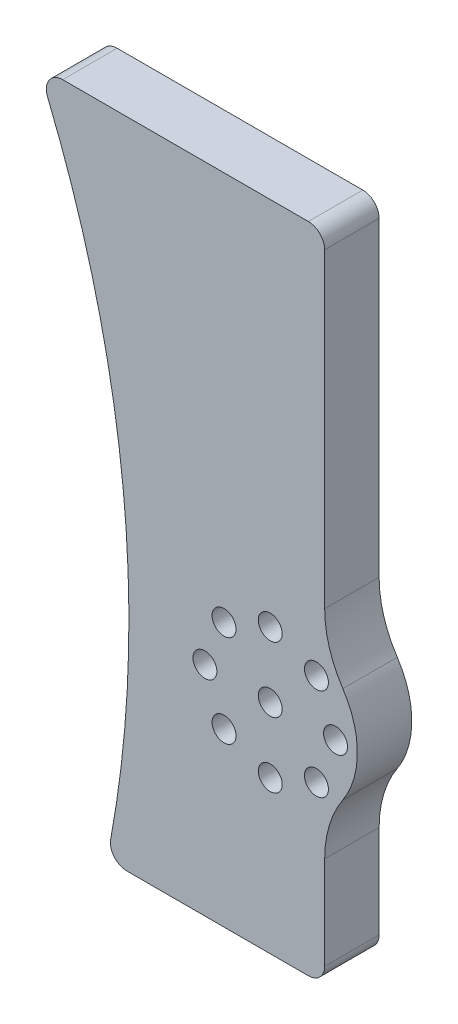
ISO-10303-21;
HEADER;
FILE_DESCRIPTION(('STEP AP214'),'2;1');
FILE_NAME('part.step','',(''),(''),'','','');
FILE_SCHEMA(('AUTOMOTIVE_DESIGN { 1 0 10303 214 1 1 1 1 }'));
ENDSEC;
DATA;
#1=APPLICATION_CONTEXT('core data for automotive mechanical design processes');
#2=APPLICATION_PROTOCOL_DEFINITION('international standard','automotive_design',2000,#1);
#3=PRODUCT_CONTEXT('',#1,'mechanical');
#4=PRODUCT('Part','Part','',(#3));
#5=PRODUCT_RELATED_PRODUCT_CATEGORY('part','',(#4));
#6=PRODUCT_DEFINITION_FORMATION('','',#4);
#7=PRODUCT_DEFINITION_CONTEXT('part definition',#1,'design');
#8=PRODUCT_DEFINITION('design','',#6,#7);
#9=PRODUCT_DEFINITION_SHAPE('','',#8);
#10=(LENGTH_UNIT() NAMED_UNIT(*) SI_UNIT(.MILLI.,.METRE.));
#11=(NAMED_UNIT(*) PLANE_ANGLE_UNIT() SI_UNIT($,.RADIAN.));
#12=(NAMED_UNIT(*) SI_UNIT($,.STERADIAN.) SOLID_ANGLE_UNIT());
#13=UNCERTAINTY_MEASURE_WITH_UNIT(LENGTH_MEASURE(1.E-05),#10,'distance_accuracy_value','');
#14=(GEOMETRIC_REPRESENTATION_CONTEXT(3) GLOBAL_UNCERTAINTY_ASSIGNED_CONTEXT((#13)) GLOBAL_UNIT_ASSIGNED_CONTEXT((#10,
#11,#12)) REPRESENTATION_CONTEXT('',''));
#15=CARTESIAN_POINT('',(0.,0.,0.));
#16=DIRECTION('',(0.,0.,1.));
#17=DIRECTION('',(1.,0.,0.));
#18=AXIS2_PLACEMENT_3D('',#15,#16,#17);
#19=CARTESIAN_POINT('',(-15.,10.0501256289338,5.));
#20=DIRECTION('',(0.,0.,-1.));
#21=DIRECTION('',(-1.,0.,0.));
#22=AXIS2_PLACEMENT_3D('',#19,#20,#21);
#23=PLANE('',#22);
#24=DIRECTION('',(1.,0.,0.));
#25=VECTOR('',#24,1.);
#26=CARTESIAN_POINT('',(-5.00000000000001,0.,5.));
#27=LINE('',#26,#25);
#28=CARTESIAN_POINT('',(-13.1797901123299,0.,5.));
#29=VERTEX_POINT('',#28);
#30=CARTESIAN_POINT('',(3.50000000000001,0.,5.));
#31=VERTEX_POINT('',#30);
#32=EDGE_CURVE('E192',#29,#31,#27,.T.);
#33=ORIENTED_EDGE('',*,*,#32,.T.);
#34=CARTESIAN_POINT('',(3.50000000000001,1.5,5.));
#35=DIRECTION('',(0.,0.,-1.));
#36=DIRECTION('',(-1.,0.,0.));
#37=AXIS2_PLACEMENT_3D('',#34,#35,#36);
#38=CIRCLE('',#37,1.5);
#39=CARTESIAN_POINT('',(5.00000000000001,1.5,5.));
#40=VERTEX_POINT('',#39);
#41=EDGE_CURVE('E128',#31,#40,#38,.F.);
#42=ORIENTED_EDGE('',*,*,#41,.T.);
#43=DIRECTION('',(0.,1.,0.));
#44=VECTOR('',#43,1.);
#45=CARTESIAN_POINT('',(5.00000000000001,10.0501256289338,5.));
#46=LINE('',#45,#44);
#47=CARTESIAN_POINT('',(5.00000000000001,10.0501256289338,5.));
#48=VERTEX_POINT('',#47);
#49=EDGE_CURVE('E121',#40,#48,#46,.T.);
#50=ORIENTED_EDGE('',*,*,#49,.T.);
#51=CARTESIAN_POINT('',(15.,10.0501256289338,5.));
#52=DIRECTION('',(0.,0.,-1.));
#53=DIRECTION('',(-1.,0.,0.));
#54=AXIS2_PLACEMENT_3D('',#51,#52,#53);
#55=CIRCLE('',#54,10.);
#56=CARTESIAN_POINT('',(6.66666666666667,15.5778336128595,5.));
#57=VERTEX_POINT('',#56);
#58=EDGE_CURVE('E125',#48,#57,#55,.T.);
#59=ORIENTED_EDGE('',*,*,#58,.T.);
#60=CARTESIAN_POINT('',(0.,20.,5.));
#61=DIRECTION('',(0.,0.,1.));
#62=DIRECTION('',(1.,0.,0.));
#63=AXIS2_PLACEMENT_3D('',#60,#61,#62);
#64=CIRCLE('',#63,8.);
#65=CARTESIAN_POINT('',(6.66666666666667,24.4221663871405,5.));
#66=VERTEX_POINT('',#65);
#67=EDGE_CURVE('E142',#57,#66,#64,.T.);
#68=ORIENTED_EDGE('',*,*,#67,.T.);
#69=CARTESIAN_POINT('',(15.,29.9498743710662,5.));
#70=DIRECTION('',(0.,0.,-1.));
#71=DIRECTION('',(1.,0.,0.));
#72=AXIS2_PLACEMENT_3D('',#69,#70,#71);
#73=CIRCLE('',#72,10.);
#74=CARTESIAN_POINT('',(5.,29.9498743710662,5.));
#75=VERTEX_POINT('',#74);
#76=EDGE_CURVE('E263',#66,#75,#73,.T.);
#77=ORIENTED_EDGE('',*,*,#76,.T.);
#78=DIRECTION('',(0.,1.,0.));
#79=VECTOR('',#78,1.);
#80=CARTESIAN_POINT('',(4.99999999999999,60.,5.));
#81=LINE('',#80,#79);
#82=CARTESIAN_POINT('',(4.99999999999999,58.5,5.));
#83=VERTEX_POINT('',#82);
#84=EDGE_CURVE('E193',#75,#83,#81,.T.);
#85=ORIENTED_EDGE('',*,*,#84,.T.);
#86=CARTESIAN_POINT('',(3.49999999999999,58.5,5.));
#87=DIRECTION('',(0.,0.,-1.));
#88=DIRECTION('',(-1.,0.,0.));
#89=AXIS2_PLACEMENT_3D('',#86,#87,#88);
#90=CIRCLE('',#89,1.5);
#91=CARTESIAN_POINT('',(3.49999999999999,60.,5.));
#92=VERTEX_POINT('',#91);
#93=EDGE_CURVE('E168',#83,#92,#90,.F.);
#94=ORIENTED_EDGE('',*,*,#93,.T.);
#95=DIRECTION('',(-1.,0.,0.));
#96=VECTOR('',#95,1.);
#97=CARTESIAN_POINT('',(-5.00000000000001,60.,5.));
#98=LINE('',#97,#96);
#99=CARTESIAN_POINT('',(-19.064734656336,60.,5.));
#100=VERTEX_POINT('',#99);
#101=EDGE_CURVE('E185',#92,#100,#98,.T.);
#102=ORIENTED_EDGE('',*,*,#101,.T.);
#103=CARTESIAN_POINT('',(-19.064734656336,58.5,5.));
#104=DIRECTION('',(0.,0.,-1.));
#105=DIRECTION('',(-1.,0.,0.));
#106=AXIS2_PLACEMENT_3D('',#103,#104,#105);
#107=CIRCLE('',#106,1.5);
#108=CARTESIAN_POINT('',(-20.4526389182324,57.9310344827586,5.));
#109=VERTEX_POINT('',#108);
#110=EDGE_CURVE('E48',#100,#109,#107,.F.);
#111=ORIENTED_EDGE('',*,*,#110,.T.);
#112=CARTESIAN_POINT('',(-112.979589711327,20.,5.));
#113=DIRECTION('',(0.,0.,1.));
#114=DIRECTION('',(-1.,0.,0.));
#115=AXIS2_PLACEMENT_3D('',#112,#113,#114);
#116=CIRCLE('',#115,100.);
#117=CARTESIAN_POINT('',(-14.6546639980294,1.77339901477833,5.));
#118=VERTEX_POINT('',#117);
#119=EDGE_CURVE('E200',#118,#109,#116,.T.);
#120=ORIENTED_EDGE('',*,*,#119,.F.);
#121=CARTESIAN_POINT('',(-13.1797901123299,1.5,5.));
#122=DIRECTION('',(0.,0.,-1.));
#123=DIRECTION('',(-1.,0.,0.));
#124=AXIS2_PLACEMENT_3D('',#121,#122,#123);
#125=CIRCLE('',#124,1.5);
#126=EDGE_CURVE('E171',#118,#29,#125,.F.);
#127=ORIENTED_EDGE('',*,*,#126,.T.);
#128=EDGE_LOOP('',(#33,#42,#50,#59,#68,#77,#85,#94,#102,#111,#120,#127));
#129=FACE_BOUND('',#128,.T.);
#130=CARTESIAN_POINT('',(0.,20.,5.));
#131=DIRECTION('',(0.,0.,1.));
#132=DIRECTION('',(1.,0.,0.));
#133=AXIS2_PLACEMENT_3D('',#130,#131,#132);
#134=CIRCLE('',#133,1.1);
#135=CARTESIAN_POINT('',(1.1,20.,5.));
#136=VERTEX_POINT('',#135);
#137=EDGE_CURVE('E257',#136,#136,#134,.T.);
#138=ORIENTED_EDGE('',*,*,#137,.F.);
#139=EDGE_LOOP('',(#138));
#140=FACE_BOUND('',#139,.T.);
#141=CARTESIAN_POINT('',(0.,14.,5.));
#142=DIRECTION('',(0.,0.,1.));
#143=DIRECTION('',(1.,0.,0.));
#144=AXIS2_PLACEMENT_3D('',#141,#142,#143);
#145=CIRCLE('',#144,1.1);
#146=CARTESIAN_POINT('',(1.1,14.,5.));
#147=VERTEX_POINT('',#146);
#148=EDGE_CURVE('E251',#147,#147,#145,.T.);
#149=ORIENTED_EDGE('',*,*,#148,.F.);
#150=EDGE_LOOP('',(#149));
#151=FACE_BOUND('',#150,.T.);
#152=CARTESIAN_POINT('',(-4.24264068711928,15.7573593128807,5.));
#153=DIRECTION('',(0.,0.,1.));
#154=DIRECTION('',(1.,0.,0.));
#155=AXIS2_PLACEMENT_3D('',#152,#153,#154);
#156=CIRCLE('',#155,1.1);
#157=CARTESIAN_POINT('',(-3.14264068711928,15.7573593128807,5.));
#158=VERTEX_POINT('',#157);
#159=EDGE_CURVE('E245',#158,#158,#156,.T.);
#160=ORIENTED_EDGE('',*,*,#159,.F.);
#161=EDGE_LOOP('',(#160));
#162=FACE_BOUND('',#161,.T.);
#163=CARTESIAN_POINT('',(-5.99999999999999,20.,5.));
#164=DIRECTION('',(0.,0.,1.));
#165=DIRECTION('',(1.,0.,0.));
#166=AXIS2_PLACEMENT_3D('',#163,#164,#165);
#167=CIRCLE('',#166,1.1);
#168=CARTESIAN_POINT('',(-4.89999999999999,20.,5.));
#169=VERTEX_POINT('',#168);
#170=EDGE_CURVE('E239',#169,#169,#167,.T.);
#171=ORIENTED_EDGE('',*,*,#170,.F.);
#172=EDGE_LOOP('',(#171));
#173=FACE_BOUND('',#172,.T.);
#174=CARTESIAN_POINT('',(-4.24264068711928,24.2426406871193,5.));
#175=DIRECTION('',(0.,0.,1.));
#176=DIRECTION('',(1.,0.,0.));
#177=AXIS2_PLACEMENT_3D('',#174,#175,#176);
#178=CIRCLE('',#177,1.1);
#179=CARTESIAN_POINT('',(-3.14264068711928,24.2426406871193,5.));
#180=VERTEX_POINT('',#179);
#181=EDGE_CURVE('E233',#180,#180,#178,.T.);
#182=ORIENTED_EDGE('',*,*,#181,.F.);
#183=EDGE_LOOP('',(#182));
#184=FACE_BOUND('',#183,.T.);
#185=CARTESIAN_POINT('',(0.,26.,5.));
#186=DIRECTION('',(0.,0.,1.));
#187=DIRECTION('',(1.,0.,0.));
#188=AXIS2_PLACEMENT_3D('',#185,#186,#187);
#189=CIRCLE('',#188,1.1);
#190=CARTESIAN_POINT('',(1.1,26.,5.));
#191=VERTEX_POINT('',#190);
#192=EDGE_CURVE('E227',#191,#191,#189,.T.);
#193=ORIENTED_EDGE('',*,*,#192,.F.);
#194=EDGE_LOOP('',(#193));
#195=FACE_BOUND('',#194,.T.);
#196=CARTESIAN_POINT('',(4.24264068711928,24.2426406871193,5.));
#197=DIRECTION('',(0.,0.,1.));
#198=DIRECTION('',(1.,0.,0.));
#199=AXIS2_PLACEMENT_3D('',#196,#197,#198);
#200=CIRCLE('',#199,1.1);
#201=CARTESIAN_POINT('',(5.34264068711928,24.2426406871193,5.));
#202=VERTEX_POINT('',#201);
#203=EDGE_CURVE('E221',#202,#202,#200,.T.);
#204=ORIENTED_EDGE('',*,*,#203,.F.);
#205=EDGE_LOOP('',(#204));
#206=FACE_BOUND('',#205,.T.);
#207=CARTESIAN_POINT('',(5.99999999999999,20.,5.));
#208=DIRECTION('',(0.,0.,1.));
#209=DIRECTION('',(1.,0.,0.));
#210=AXIS2_PLACEMENT_3D('',#207,#208,#209);
#211=CIRCLE('',#210,1.1);
#212=CARTESIAN_POINT('',(7.09999999999999,20.,5.));
#213=VERTEX_POINT('',#212);
#214=EDGE_CURVE('E215',#213,#213,#211,.T.);
#215=ORIENTED_EDGE('',*,*,#214,.F.);
#216=EDGE_LOOP('',(#215));
#217=FACE_BOUND('',#216,.T.);
#218=CARTESIAN_POINT('',(4.24264068711927,15.7573593128807,5.));
#219=DIRECTION('',(0.,0.,1.));
#220=DIRECTION('',(1.,0.,0.));
#221=AXIS2_PLACEMENT_3D('',#218,#219,#220);
#222=CIRCLE('',#221,1.1);
#223=CARTESIAN_POINT('',(5.34264068711927,15.7573593128807,5.));
#224=VERTEX_POINT('',#223);
#225=EDGE_CURVE('E209',#224,#224,#222,.T.);
#226=ORIENTED_EDGE('',*,*,#225,.F.);
#227=EDGE_LOOP('',(#226));
#228=FACE_BOUND('',#227,.T.);
#229=ADVANCED_FACE('F33',(#129,#140,#151,#162,#173,#184,#195,#206,#217,#228),#23,.F.);
#230=CARTESIAN_POINT('',(-15.,10.0501256289338,0.));
#231=DIRECTION('',(0.,0.,-1.));
#232=DIRECTION('',(-1.,0.,0.));
#233=AXIS2_PLACEMENT_3D('',#230,#231,#232);
#234=PLANE('',#233);
#235=CARTESIAN_POINT('',(5.99999999999999,20.,0.));
#236=DIRECTION('',(0.,0.,1.));
#237=DIRECTION('',(1.,0.,0.));
#238=AXIS2_PLACEMENT_3D('',#235,#236,#237);
#239=CIRCLE('',#238,1.1);
#240=CARTESIAN_POINT('',(7.09999999999999,20.,0.));
#241=VERTEX_POINT('',#240);
#242=EDGE_CURVE('E212',#241,#241,#239,.T.);
#243=ORIENTED_EDGE('',*,*,#242,.T.);
#244=EDGE_LOOP('',(#243));
#245=FACE_BOUND('',#244,.T.);
#246=CARTESIAN_POINT('',(0.,26.,0.));
#247=DIRECTION('',(0.,0.,1.));
#248=DIRECTION('',(1.,0.,0.));
#249=AXIS2_PLACEMENT_3D('',#246,#247,#248);
#250=CIRCLE('',#249,1.1);
#251=CARTESIAN_POINT('',(1.1,26.,0.));
#252=VERTEX_POINT('',#251);
#253=EDGE_CURVE('E224',#252,#252,#250,.T.);
#254=ORIENTED_EDGE('',*,*,#253,.T.);
#255=EDGE_LOOP('',(#254));
#256=FACE_BOUND('',#255,.T.);
#257=CARTESIAN_POINT('',(-5.99999999999999,20.,0.));
#258=DIRECTION('',(0.,0.,1.));
#259=DIRECTION('',(1.,0.,0.));
#260=AXIS2_PLACEMENT_3D('',#257,#258,#259);
#261=CIRCLE('',#260,1.1);
#262=CARTESIAN_POINT('',(-4.89999999999999,20.,0.));
#263=VERTEX_POINT('',#262);
#264=EDGE_CURVE('E236',#263,#263,#261,.T.);
#265=ORIENTED_EDGE('',*,*,#264,.T.);
#266=EDGE_LOOP('',(#265));
#267=FACE_BOUND('',#266,.T.);
#268=CARTESIAN_POINT('',(0.,14.,0.));
#269=DIRECTION('',(0.,0.,1.));
#270=DIRECTION('',(1.,0.,0.));
#271=AXIS2_PLACEMENT_3D('',#268,#269,#270);
#272=CIRCLE('',#271,1.1);
#273=CARTESIAN_POINT('',(1.1,14.,0.));
#274=VERTEX_POINT('',#273);
#275=EDGE_CURVE('E248',#274,#274,#272,.T.);
#276=ORIENTED_EDGE('',*,*,#275,.T.);
#277=EDGE_LOOP('',(#276));
#278=FACE_BOUND('',#277,.T.);
#279=DIRECTION('',(0.,1.,0.));
#280=VECTOR('',#279,1.);
#281=CARTESIAN_POINT('',(5.00000000000001,10.0501256289338,0.));
#282=LINE('',#281,#280);
#283=CARTESIAN_POINT('',(5.00000000000001,1.5,0.));
#284=VERTEX_POINT('',#283);
#285=CARTESIAN_POINT('',(5.00000000000001,10.0501256289338,0.));
#286=VERTEX_POINT('',#285);
#287=EDGE_CURVE('E146',#284,#286,#282,.T.);
#288=ORIENTED_EDGE('',*,*,#287,.F.);
#289=CARTESIAN_POINT('',(3.50000000000001,1.5,0.));
#290=DIRECTION('',(0.,0.,-1.));
#291=DIRECTION('',(-1.,0.,0.));
#292=AXIS2_PLACEMENT_3D('',#289,#290,#291);
#293=CIRCLE('',#292,1.5);
#294=CARTESIAN_POINT('',(3.50000000000001,0.,0.));
#295=VERTEX_POINT('',#294);
#296=EDGE_CURVE('E161',#284,#295,#293,.T.);
#297=ORIENTED_EDGE('',*,*,#296,.T.);
#298=DIRECTION('',(1.,0.,0.));
#299=VECTOR('',#298,1.);
#300=CARTESIAN_POINT('',(-5.00000000000001,0.,0.));
#301=LINE('',#300,#299);
#302=CARTESIAN_POINT('',(-13.1797901123299,0.,0.));
#303=VERTEX_POINT('',#302);
#304=EDGE_CURVE('E133',#303,#295,#301,.T.);
#305=ORIENTED_EDGE('',*,*,#304,.F.);
#306=CARTESIAN_POINT('',(-13.1797901123299,1.5,0.));
#307=DIRECTION('',(0.,0.,-1.));
#308=DIRECTION('',(-1.,0.,0.));
#309=AXIS2_PLACEMENT_3D('',#306,#307,#308);
#310=CIRCLE('',#309,1.5);
#311=CARTESIAN_POINT('',(-14.6546639980294,1.77339901477833,0.));
#312=VERTEX_POINT('',#311);
#313=EDGE_CURVE('E159',#303,#312,#310,.T.);
#314=ORIENTED_EDGE('',*,*,#313,.T.);
#315=CARTESIAN_POINT('',(-112.979589711327,20.,0.));
#316=DIRECTION('',(0.,0.,1.));
#317=DIRECTION('',(-1.,0.,0.));
#318=AXIS2_PLACEMENT_3D('',#315,#316,#317);
#319=CIRCLE('',#318,100.);
#320=CARTESIAN_POINT('',(-20.4526389182324,57.9310344827586,0.));
#321=VERTEX_POINT('',#320);
#322=EDGE_CURVE('E199',#312,#321,#319,.T.);
#323=ORIENTED_EDGE('',*,*,#322,.T.);
#324=CARTESIAN_POINT('',(-19.064734656336,58.5,0.));
#325=DIRECTION('',(0.,0.,-1.));
#326=DIRECTION('',(-1.,0.,0.));
#327=AXIS2_PLACEMENT_3D('',#324,#325,#326);
#328=CIRCLE('',#327,1.5);
#329=CARTESIAN_POINT('',(-19.064734656336,60.,0.));
#330=VERTEX_POINT('',#329);
#331=EDGE_CURVE('E157',#321,#330,#328,.T.);
#332=ORIENTED_EDGE('',*,*,#331,.T.);
#333=DIRECTION('',(-1.,0.,0.));
#334=VECTOR('',#333,1.);
#335=CARTESIAN_POINT('',(-5.00000000000001,60.,0.));
#336=LINE('',#335,#334);
#337=CARTESIAN_POINT('',(3.49999999999999,60.,0.));
#338=VERTEX_POINT('',#337);
#339=EDGE_CURVE('E188',#338,#330,#336,.T.);
#340=ORIENTED_EDGE('',*,*,#339,.F.);
#341=CARTESIAN_POINT('',(3.49999999999999,58.5,0.));
#342=DIRECTION('',(0.,0.,-1.));
#343=DIRECTION('',(-1.,0.,0.));
#344=AXIS2_PLACEMENT_3D('',#341,#342,#343);
#345=CIRCLE('',#344,1.5);
#346=CARTESIAN_POINT('',(4.99999999999999,58.5,0.));
#347=VERTEX_POINT('',#346);
#348=EDGE_CURVE('E150',#338,#347,#345,.T.);
#349=ORIENTED_EDGE('',*,*,#348,.T.);
#350=DIRECTION('',(0.,1.,0.));
#351=VECTOR('',#350,1.);
#352=CARTESIAN_POINT('',(4.99999999999999,60.,0.));
#353=LINE('',#352,#351);
#354=CARTESIAN_POINT('',(5.,29.9498743710662,0.));
#355=VERTEX_POINT('',#354);
#356=EDGE_CURVE('E275',#355,#347,#353,.T.);
#357=ORIENTED_EDGE('',*,*,#356,.F.);
#358=CARTESIAN_POINT('',(15.,29.9498743710662,0.));
#359=DIRECTION('',(0.,0.,-1.));
#360=DIRECTION('',(1.,0.,0.));
#361=AXIS2_PLACEMENT_3D('',#358,#359,#360);
#362=CIRCLE('',#361,10.);
#363=CARTESIAN_POINT('',(6.66666666666667,24.4221663871405,0.));
#364=VERTEX_POINT('',#363);
#365=EDGE_CURVE('E273',#364,#355,#362,.T.);
#366=ORIENTED_EDGE('',*,*,#365,.F.);
#367=CARTESIAN_POINT('',(0.,20.,0.));
#368=DIRECTION('',(0.,0.,1.));
#369=DIRECTION('',(1.,0.,0.));
#370=AXIS2_PLACEMENT_3D('',#367,#368,#369);
#371=CIRCLE('',#370,8.);
#372=CARTESIAN_POINT('',(6.66666666666667,15.5778336128595,0.));
#373=VERTEX_POINT('',#372);
#374=EDGE_CURVE('E271',#373,#364,#371,.T.);
#375=ORIENTED_EDGE('',*,*,#374,.F.);
#376=CARTESIAN_POINT('',(15.,10.0501256289338,0.));
#377=DIRECTION('',(0.,0.,-1.));
#378=DIRECTION('',(-1.,0.,0.));
#379=AXIS2_PLACEMENT_3D('',#376,#377,#378);
#380=CIRCLE('',#379,10.);
#381=EDGE_CURVE('E269',#286,#373,#380,.T.);
#382=ORIENTED_EDGE('',*,*,#381,.F.);
#383=EDGE_LOOP('',(#288,#297,#305,#314,#323,#332,#340,#349,#357,#366,#375,#382));
#384=FACE_BOUND('',#383,.T.);
#385=CARTESIAN_POINT('',(0.,20.,0.));
#386=DIRECTION('',(0.,0.,1.));
#387=DIRECTION('',(1.,0.,0.));
#388=AXIS2_PLACEMENT_3D('',#385,#386,#387);
#389=CIRCLE('',#388,1.1);
#390=CARTESIAN_POINT('',(1.1,20.,0.));
#391=VERTEX_POINT('',#390);
#392=EDGE_CURVE('E254',#391,#391,#389,.T.);
#393=ORIENTED_EDGE('',*,*,#392,.T.);
#394=EDGE_LOOP('',(#393));
#395=FACE_BOUND('',#394,.T.);
#396=CARTESIAN_POINT('',(-4.24264068711928,15.7573593128807,0.));
#397=DIRECTION('',(0.,0.,1.));
#398=DIRECTION('',(1.,0.,0.));
#399=AXIS2_PLACEMENT_3D('',#396,#397,#398);
#400=CIRCLE('',#399,1.1);
#401=CARTESIAN_POINT('',(-3.14264068711928,15.7573593128807,0.));
#402=VERTEX_POINT('',#401);
#403=EDGE_CURVE('E242',#402,#402,#400,.T.);
#404=ORIENTED_EDGE('',*,*,#403,.T.);
#405=EDGE_LOOP('',(#404));
#406=FACE_BOUND('',#405,.T.);
#407=CARTESIAN_POINT('',(-4.24264068711928,24.2426406871193,0.));
#408=DIRECTION('',(0.,0.,1.));
#409=DIRECTION('',(1.,0.,0.));
#410=AXIS2_PLACEMENT_3D('',#407,#408,#409);
#411=CIRCLE('',#410,1.1);
#412=CARTESIAN_POINT('',(-3.14264068711928,24.2426406871193,0.));
#413=VERTEX_POINT('',#412);
#414=EDGE_CURVE('E230',#413,#413,#411,.T.);
#415=ORIENTED_EDGE('',*,*,#414,.T.);
#416=EDGE_LOOP('',(#415));
#417=FACE_BOUND('',#416,.T.);
#418=CARTESIAN_POINT('',(4.24264068711928,24.2426406871193,0.));
#419=DIRECTION('',(0.,0.,1.));
#420=DIRECTION('',(1.,0.,0.));
#421=AXIS2_PLACEMENT_3D('',#418,#419,#420);
#422=CIRCLE('',#421,1.1);
#423=CARTESIAN_POINT('',(5.34264068711928,24.2426406871193,0.));
#424=VERTEX_POINT('',#423);
#425=EDGE_CURVE('E218',#424,#424,#422,.T.);
#426=ORIENTED_EDGE('',*,*,#425,.T.);
#427=EDGE_LOOP('',(#426));
#428=FACE_BOUND('',#427,.T.);
#429=CARTESIAN_POINT('',(4.24264068711927,15.7573593128807,0.));
#430=DIRECTION('',(0.,0.,1.));
#431=DIRECTION('',(1.,0.,0.));
#432=AXIS2_PLACEMENT_3D('',#429,#430,#431);
#433=CIRCLE('',#432,1.1);
#434=CARTESIAN_POINT('',(5.34264068711927,15.7573593128807,0.));
#435=VERTEX_POINT('',#434);
#436=EDGE_CURVE('E206',#435,#435,#433,.T.);
#437=ORIENTED_EDGE('',*,*,#436,.T.);
#438=EDGE_LOOP('',(#437));
#439=FACE_BOUND('',#438,.T.);
#440=ADVANCED_FACE('F202',(#245,#256,#267,#278,#384,#395,#406,#417,#428,#439),#234,.T.);
#441=CARTESIAN_POINT('',(5.00000000000001,10.0501256289338,5.));
#442=DIRECTION('',(-1.,0.,0.));
#443=DIRECTION('',(0.,-1.,0.));
#444=AXIS2_PLACEMENT_3D('',#441,#442,#443);
#445=PLANE('',#444);
#446=ORIENTED_EDGE('',*,*,#49,.F.);
#447=DIRECTION('',(0.,0.,-1.));
#448=VECTOR('',#447,1.);
#449=CARTESIAN_POINT('',(5.00000000000001,1.5,5.));
#450=LINE('',#449,#448);
#451=EDGE_CURVE('E148',#40,#284,#450,.T.);
#452=ORIENTED_EDGE('',*,*,#451,.T.);
#453=ORIENTED_EDGE('',*,*,#287,.T.);
#454=DIRECTION('',(0.,0.,-1.));
#455=VECTOR('',#454,1.);
#456=CARTESIAN_POINT('',(5.00000000000001,10.0501256289338,5.));
#457=LINE('',#456,#455);
#458=EDGE_CURVE('E138',#48,#286,#457,.T.);
#459=ORIENTED_EDGE('',*,*,#458,.F.);
#460=EDGE_LOOP('',(#446,#452,#453,#459));
#461=FACE_BOUND('',#460,.T.);
#462=ADVANCED_FACE('F144',(#461),#445,.F.);
#463=CARTESIAN_POINT('',(15.,10.0501256289338,5.));
#464=DIRECTION('',(0.,0.,-1.));
#465=DIRECTION('',(-1.,0.,0.));
#466=AXIS2_PLACEMENT_3D('',#463,#464,#465);
#467=CYLINDRICAL_SURFACE('',#466,10.);
#468=ORIENTED_EDGE('',*,*,#381,.T.);
#469=DIRECTION('',(0.,0.,-1.));
#470=VECTOR('',#469,1.);
#471=CARTESIAN_POINT('',(6.66666666666667,15.5778336128595,5.));
#472=LINE('',#471,#470);
#473=EDGE_CURVE('E140',#57,#373,#472,.T.);
#474=ORIENTED_EDGE('',*,*,#473,.F.);
#475=ORIENTED_EDGE('',*,*,#58,.F.);
#476=ORIENTED_EDGE('',*,*,#458,.T.);
#477=EDGE_LOOP('',(#468,#474,#475,#476));
#478=FACE_BOUND('',#477,.T.);
#479=ADVANCED_FACE('F137',(#478),#467,.F.);
#480=CARTESIAN_POINT('',(0.,20.,5.));
#481=DIRECTION('',(0.,0.,-1.));
#482=DIRECTION('',(-1.,0.,0.));
#483=AXIS2_PLACEMENT_3D('',#480,#481,#482);
#484=CYLINDRICAL_SURFACE('',#483,8.);
#485=ORIENTED_EDGE('',*,*,#374,.T.);
#486=DIRECTION('',(0.,0.,-1.));
#487=VECTOR('',#486,1.);
#488=CARTESIAN_POINT('',(6.66666666666667,24.4221663871405,5.));
#489=LINE('',#488,#487);
#490=EDGE_CURVE('E152',#66,#364,#489,.T.);
#491=ORIENTED_EDGE('',*,*,#490,.F.);
#492=ORIENTED_EDGE('',*,*,#67,.F.);
#493=ORIENTED_EDGE('',*,*,#473,.T.);
#494=EDGE_LOOP('',(#485,#491,#492,#493));
#495=FACE_BOUND('',#494,.T.);
#496=ADVANCED_FACE('F323',(#495),#484,.T.);
#497=CARTESIAN_POINT('',(15.,29.9498743710662,5.));
#498=DIRECTION('',(0.,0.,-1.));
#499=DIRECTION('',(-1.,0.,0.));
#500=AXIS2_PLACEMENT_3D('',#497,#498,#499);
#501=CYLINDRICAL_SURFACE('',#500,10.);
#502=ORIENTED_EDGE('',*,*,#365,.T.);
#503=DIRECTION('',(0.,0.,-1.));
#504=VECTOR('',#503,1.);
#505=CARTESIAN_POINT('',(5.,29.9498743710662,5.));
#506=LINE('',#505,#504);
#507=EDGE_CURVE('E267',#75,#355,#506,.T.);
#508=ORIENTED_EDGE('',*,*,#507,.F.);
#509=ORIENTED_EDGE('',*,*,#76,.F.);
#510=ORIENTED_EDGE('',*,*,#490,.T.);
#511=EDGE_LOOP('',(#502,#508,#509,#510));
#512=FACE_BOUND('',#511,.T.);
#513=ADVANCED_FACE('F287',(#512),#501,.F.);
#514=CARTESIAN_POINT('',(4.99999999999999,60.,5.));
#515=DIRECTION('',(-1.,0.,0.));
#516=DIRECTION('',(0.,-1.,0.));
#517=AXIS2_PLACEMENT_3D('',#514,#515,#516);
#518=PLANE('',#517);
#519=ORIENTED_EDGE('',*,*,#356,.T.);
#520=DIRECTION('',(0.,0.,-1.));
#521=VECTOR('',#520,1.);
#522=CARTESIAN_POINT('',(4.99999999999999,58.5,5.));
#523=LINE('',#522,#521);
#524=EDGE_CURVE('E11',#347,#83,#523,.F.);
#525=ORIENTED_EDGE('',*,*,#524,.T.);
#526=ORIENTED_EDGE('',*,*,#84,.F.);
#527=ORIENTED_EDGE('',*,*,#507,.T.);
#528=EDGE_LOOP('',(#519,#525,#526,#527));
#529=FACE_BOUND('',#528,.T.);
#530=ADVANCED_FACE('F294',(#529),#518,.F.);
#531=CARTESIAN_POINT('',(-5.00000000000001,60.,5.));
#532=DIRECTION('',(0.,-1.,0.));
#533=DIRECTION('',(0.,0.,-1.));
#534=AXIS2_PLACEMENT_3D('',#531,#532,#533);
#535=PLANE('',#534);
#536=ORIENTED_EDGE('',*,*,#339,.T.);
#537=DIRECTION('',(0.,0.,1.));
#538=VECTOR('',#537,1.);
#539=CARTESIAN_POINT('',(-19.064734656336,60.,5.));
#540=LINE('',#539,#538);
#541=EDGE_CURVE('E41',#330,#100,#540,.T.);
#542=ORIENTED_EDGE('',*,*,#541,.T.);
#543=ORIENTED_EDGE('',*,*,#101,.F.);
#544=DIRECTION('',(0.,0.,-1.));
#545=VECTOR('',#544,1.);
#546=CARTESIAN_POINT('',(3.49999999999999,60.,5.));
#547=LINE('',#546,#545);
#548=EDGE_CURVE('E178',#92,#338,#547,.T.);
#549=ORIENTED_EDGE('',*,*,#548,.T.);
#550=EDGE_LOOP('',(#536,#542,#543,#549));
#551=FACE_BOUND('',#550,.T.);
#552=ADVANCED_FACE('F184',(#551),#535,.F.);
#553=CARTESIAN_POINT('',(-5.00000000000001,0.,5.));
#554=DIRECTION('',(0.,1.,0.));
#555=DIRECTION('',(0.,0.,1.));
#556=AXIS2_PLACEMENT_3D('',#553,#554,#555);
#557=PLANE('',#556);
#558=ORIENTED_EDGE('',*,*,#304,.T.);
#559=DIRECTION('',(0.,0.,-1.));
#560=VECTOR('',#559,1.);
#561=CARTESIAN_POINT('',(3.50000000000001,0.,5.));
#562=LINE('',#561,#560);
#563=EDGE_CURVE('E166',#295,#31,#562,.F.);
#564=ORIENTED_EDGE('',*,*,#563,.T.);
#565=ORIENTED_EDGE('',*,*,#32,.F.);
#566=DIRECTION('',(0.,0.,1.));
#567=VECTOR('',#566,1.);
#568=CARTESIAN_POINT('',(-13.1797901123299,0.,0.));
#569=LINE('',#568,#567);
#570=EDGE_CURVE('E163',#29,#303,#569,.F.);
#571=ORIENTED_EDGE('',*,*,#570,.T.);
#572=EDGE_LOOP('',(#558,#564,#565,#571));
#573=FACE_BOUND('',#572,.T.);
#574=ADVANCED_FACE('F313',(#573),#557,.F.);
#575=CARTESIAN_POINT('',(0.,20.,5.));
#576=DIRECTION('',(0.,0.,-1.));
#577=DIRECTION('',(-1.,0.,0.));
#578=AXIS2_PLACEMENT_3D('',#575,#576,#577);
#579=CYLINDRICAL_SURFACE('',#578,1.1);
#580=ORIENTED_EDGE('',*,*,#137,.T.);
#581=EDGE_LOOP('',(#580));
#582=FACE_BOUND('',#581,.T.);
#583=ORIENTED_EDGE('',*,*,#392,.F.);
#584=EDGE_LOOP('',(#583));
#585=FACE_BOUND('',#584,.T.);
#586=ADVANCED_FACE('F310',(#582,#585),#579,.F.);
#587=CARTESIAN_POINT('',(0.,14.,5.));
#588=DIRECTION('',(0.,0.,-1.));
#589=DIRECTION('',(-1.,0.,0.));
#590=AXIS2_PLACEMENT_3D('',#587,#588,#589);
#591=CYLINDRICAL_SURFACE('',#590,1.1);
#592=ORIENTED_EDGE('',*,*,#148,.T.);
#593=EDGE_LOOP('',(#592));
#594=FACE_BOUND('',#593,.T.);
#595=ORIENTED_EDGE('',*,*,#275,.F.);
#596=EDGE_LOOP('',(#595));
#597=FACE_BOUND('',#596,.T.);
#598=ADVANCED_FACE('F466',(#594,#597),#591,.F.);
#599=CARTESIAN_POINT('',(-4.24264068711928,15.7573593128807,5.));
#600=DIRECTION('',(0.,0.,-1.));
#601=DIRECTION('',(-1.,0.,0.));
#602=AXIS2_PLACEMENT_3D('',#599,#600,#601);
#603=CYLINDRICAL_SURFACE('',#602,1.1);
#604=ORIENTED_EDGE('',*,*,#159,.T.);
#605=EDGE_LOOP('',(#604));
#606=FACE_BOUND('',#605,.T.);
#607=ORIENTED_EDGE('',*,*,#403,.F.);
#608=EDGE_LOOP('',(#607));
#609=FACE_BOUND('',#608,.T.);
#610=ADVANCED_FACE('F457',(#606,#609),#603,.F.);
#611=CARTESIAN_POINT('',(-5.99999999999999,20.,5.));
#612=DIRECTION('',(0.,0.,-1.));
#613=DIRECTION('',(-1.,0.,0.));
#614=AXIS2_PLACEMENT_3D('',#611,#612,#613);
#615=CYLINDRICAL_SURFACE('',#614,1.1);
#616=ORIENTED_EDGE('',*,*,#170,.T.);
#617=EDGE_LOOP('',(#616));
#618=FACE_BOUND('',#617,.T.);
#619=ORIENTED_EDGE('',*,*,#264,.F.);
#620=EDGE_LOOP('',(#619));
#621=FACE_BOUND('',#620,.T.);
#622=ADVANCED_FACE('F448',(#618,#621),#615,.F.);
#623=CARTESIAN_POINT('',(-4.24264068711928,24.2426406871193,5.));
#624=DIRECTION('',(0.,0.,-1.));
#625=DIRECTION('',(-1.,0.,0.));
#626=AXIS2_PLACEMENT_3D('',#623,#624,#625);
#627=CYLINDRICAL_SURFACE('',#626,1.1);
#628=ORIENTED_EDGE('',*,*,#181,.T.);
#629=EDGE_LOOP('',(#628));
#630=FACE_BOUND('',#629,.T.);
#631=ORIENTED_EDGE('',*,*,#414,.F.);
#632=EDGE_LOOP('',(#631));
#633=FACE_BOUND('',#632,.T.);
#634=ADVANCED_FACE('F439',(#630,#633),#627,.F.);
#635=CARTESIAN_POINT('',(0.,26.,5.));
#636=DIRECTION('',(0.,0.,-1.));
#637=DIRECTION('',(-1.,0.,0.));
#638=AXIS2_PLACEMENT_3D('',#635,#636,#637);
#639=CYLINDRICAL_SURFACE('',#638,1.1);
#640=ORIENTED_EDGE('',*,*,#192,.T.);
#641=EDGE_LOOP('',(#640));
#642=FACE_BOUND('',#641,.T.);
#643=ORIENTED_EDGE('',*,*,#253,.F.);
#644=EDGE_LOOP('',(#643));
#645=FACE_BOUND('',#644,.T.);
#646=ADVANCED_FACE('F430',(#642,#645),#639,.F.);
#647=CARTESIAN_POINT('',(4.24264068711928,24.2426406871193,5.));
#648=DIRECTION('',(0.,0.,-1.));
#649=DIRECTION('',(-1.,0.,0.));
#650=AXIS2_PLACEMENT_3D('',#647,#648,#649);
#651=CYLINDRICAL_SURFACE('',#650,1.1);
#652=ORIENTED_EDGE('',*,*,#203,.T.);
#653=EDGE_LOOP('',(#652));
#654=FACE_BOUND('',#653,.T.);
#655=ORIENTED_EDGE('',*,*,#425,.F.);
#656=EDGE_LOOP('',(#655));
#657=FACE_BOUND('',#656,.T.);
#658=ADVANCED_FACE('F421',(#654,#657),#651,.F.);
#659=CARTESIAN_POINT('',(5.99999999999999,20.,5.));
#660=DIRECTION('',(0.,0.,-1.));
#661=DIRECTION('',(-1.,0.,0.));
#662=AXIS2_PLACEMENT_3D('',#659,#660,#661);
#663=CYLINDRICAL_SURFACE('',#662,1.1);
#664=ORIENTED_EDGE('',*,*,#214,.T.);
#665=EDGE_LOOP('',(#664));
#666=FACE_BOUND('',#665,.T.);
#667=ORIENTED_EDGE('',*,*,#242,.F.);
#668=EDGE_LOOP('',(#667));
#669=FACE_BOUND('',#668,.T.);
#670=ADVANCED_FACE('F412',(#666,#669),#663,.F.);
#671=CARTESIAN_POINT('',(4.24264068711927,15.7573593128807,5.));
#672=DIRECTION('',(0.,0.,-1.));
#673=DIRECTION('',(-1.,0.,0.));
#674=AXIS2_PLACEMENT_3D('',#671,#672,#673);
#675=CYLINDRICAL_SURFACE('',#674,1.1);
#676=ORIENTED_EDGE('',*,*,#225,.T.);
#677=EDGE_LOOP('',(#676));
#678=FACE_BOUND('',#677,.T.);
#679=ORIENTED_EDGE('',*,*,#436,.F.);
#680=EDGE_LOOP('',(#679));
#681=FACE_BOUND('',#680,.T.);
#682=ADVANCED_FACE('F368',(#678,#681),#675,.F.);
#683=CARTESIAN_POINT('',(-112.979589711327,20.,5.));
#684=DIRECTION('',(0.,0.,-1.));
#685=DIRECTION('',(-1.,0.,0.));
#686=AXIS2_PLACEMENT_3D('',#683,#684,#685);
#687=CYLINDRICAL_SURFACE('',#686,100.);
#688=ORIENTED_EDGE('',*,*,#322,.F.);
#689=DIRECTION('',(0.,0.,-1.));
#690=VECTOR('',#689,1.);
#691=CARTESIAN_POINT('',(-14.6546639980294,1.77339901477832,5.));
#692=LINE('',#691,#690);
#693=EDGE_CURVE('E55',#312,#118,#692,.F.);
#694=ORIENTED_EDGE('',*,*,#693,.T.);
#695=ORIENTED_EDGE('',*,*,#119,.T.);
#696=DIRECTION('',(0.,0.,-1.));
#697=VECTOR('',#696,1.);
#698=CARTESIAN_POINT('',(-20.4526389182324,57.9310344827586,5.));
#699=LINE('',#698,#697);
#700=EDGE_CURVE('E174',#109,#321,#699,.T.);
#701=ORIENTED_EDGE('',*,*,#700,.T.);
#702=EDGE_LOOP('',(#688,#694,#695,#701));
#703=FACE_BOUND('',#702,.T.);
#704=ADVANCED_FACE('F198',(#703),#687,.F.);
#705=CARTESIAN_POINT('',(3.50000000000001,1.5,5.));
#706=DIRECTION('',(0.,0.,-1.));
#707=DIRECTION('',(-1.,0.,0.));
#708=AXIS2_PLACEMENT_3D('',#705,#706,#707);
#709=CYLINDRICAL_SURFACE('',#708,1.5);
#710=ORIENTED_EDGE('',*,*,#41,.F.);
#711=ORIENTED_EDGE('',*,*,#563,.F.);
#712=ORIENTED_EDGE('',*,*,#296,.F.);
#713=ORIENTED_EDGE('',*,*,#451,.F.);
#714=EDGE_LOOP('',(#710,#711,#712,#713));
#715=FACE_BOUND('',#714,.T.);
#716=ADVANCED_FACE('F330',(#715),#709,.T.);
#717=CARTESIAN_POINT('',(-13.1797901123299,1.5,5.));
#718=DIRECTION('',(0.,0.,-1.));
#719=DIRECTION('',(-1.,0.,0.));
#720=AXIS2_PLACEMENT_3D('',#717,#718,#719);
#721=CYLINDRICAL_SURFACE('',#720,1.5);
#722=ORIENTED_EDGE('',*,*,#126,.F.);
#723=ORIENTED_EDGE('',*,*,#693,.F.);
#724=ORIENTED_EDGE('',*,*,#313,.F.);
#725=ORIENTED_EDGE('',*,*,#570,.F.);
#726=EDGE_LOOP('',(#722,#723,#724,#725));
#727=FACE_BOUND('',#726,.T.);
#728=ADVANCED_FACE('F301',(#727),#721,.T.);
#729=CARTESIAN_POINT('',(-19.064734656336,58.5,5.));
#730=DIRECTION('',(0.,0.,-1.));
#731=DIRECTION('',(-1.,0.,0.));
#732=AXIS2_PLACEMENT_3D('',#729,#730,#731);
#733=CYLINDRICAL_SURFACE('',#732,1.5);
#734=ORIENTED_EDGE('',*,*,#110,.F.);
#735=ORIENTED_EDGE('',*,*,#541,.F.);
#736=ORIENTED_EDGE('',*,*,#331,.F.);
#737=ORIENTED_EDGE('',*,*,#700,.F.);
#738=EDGE_LOOP('',(#734,#735,#736,#737));
#739=FACE_BOUND('',#738,.T.);
#740=ADVANCED_FACE('F196',(#739),#733,.T.);
#741=CARTESIAN_POINT('',(3.49999999999999,58.5,5.));
#742=DIRECTION('',(0.,0.,-1.));
#743=DIRECTION('',(-1.,0.,0.));
#744=AXIS2_PLACEMENT_3D('',#741,#742,#743);
#745=CYLINDRICAL_SURFACE('',#744,1.5);
#746=ORIENTED_EDGE('',*,*,#93,.F.);
#747=ORIENTED_EDGE('',*,*,#524,.F.);
#748=ORIENTED_EDGE('',*,*,#348,.F.);
#749=ORIENTED_EDGE('',*,*,#548,.F.);
#750=EDGE_LOOP('',(#746,#747,#748,#749));
#751=FACE_BOUND('',#750,.T.);
#752=ADVANCED_FACE('F35',(#751),#745,.T.);
#753=CLOSED_SHELL('',(#229,#440,#462,#479,#496,#513,#530,#552,#574,#586,#598,#610,#622,#634,
#646,#658,#670,#682,#704,#716,#728,#740,#752));
#754=MANIFOLD_SOLID_BREP('B2',#753);
#755=ADVANCED_BREP_SHAPE_REPRESENTATION('',(#18,#754),#14);
#756=SHAPE_DEFINITION_REPRESENTATION(#9,#755);
ENDSEC;
END-ISO-10303-21;
